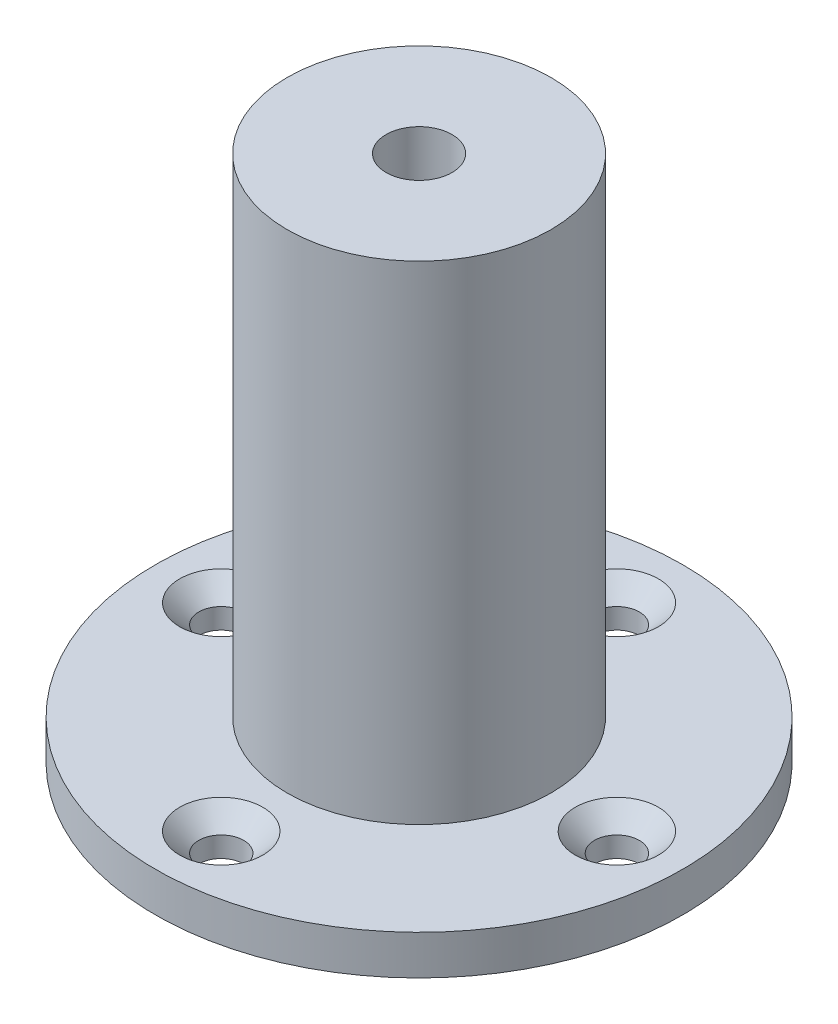
ISO-10303-21;
HEADER;
FILE_DESCRIPTION(('STEP AP214'),'2;1');
FILE_NAME('part.step','',(''),(''),'','','');
FILE_SCHEMA(('AUTOMOTIVE_DESIGN { 1 0 10303 214 1 1 1 1 }'));
ENDSEC;
DATA;
#1=APPLICATION_CONTEXT('core data for automotive mechanical design processes');
#2=APPLICATION_PROTOCOL_DEFINITION('international standard','automotive_design',2000,#1);
#3=PRODUCT_CONTEXT('',#1,'mechanical');
#4=PRODUCT('Part','Part','',(#3));
#5=PRODUCT_RELATED_PRODUCT_CATEGORY('part','',(#4));
#6=PRODUCT_DEFINITION_FORMATION('','',#4);
#7=PRODUCT_DEFINITION_CONTEXT('part definition',#1,'design');
#8=PRODUCT_DEFINITION('design','',#6,#7);
#9=PRODUCT_DEFINITION_SHAPE('','',#8);
#10=(LENGTH_UNIT() NAMED_UNIT(*) SI_UNIT(.MILLI.,.METRE.));
#11=(NAMED_UNIT(*) PLANE_ANGLE_UNIT() SI_UNIT($,.RADIAN.));
#12=(NAMED_UNIT(*) SI_UNIT($,.STERADIAN.) SOLID_ANGLE_UNIT());
#13=UNCERTAINTY_MEASURE_WITH_UNIT(LENGTH_MEASURE(1.E-05),#10,'distance_accuracy_value','');
#14=(GEOMETRIC_REPRESENTATION_CONTEXT(3) GLOBAL_UNCERTAINTY_ASSIGNED_CONTEXT((#13)) GLOBAL_UNIT_ASSIGNED_CONTEXT((#10,
#11,#12)) REPRESENTATION_CONTEXT('',''));
#15=CARTESIAN_POINT('',(0.,0.,0.));
#16=DIRECTION('',(0.,0.,1.));
#17=DIRECTION('',(1.,0.,0.));
#18=AXIS2_PLACEMENT_3D('',#15,#16,#17);
#19=CARTESIAN_POINT('',(0.,40.,0.));
#20=DIRECTION('',(0.,-1.,0.));
#21=DIRECTION('',(0.,0.,-1.));
#22=AXIS2_PLACEMENT_3D('',#19,#20,#21);
#23=CYLINDRICAL_SURFACE('',#22,10.);
#24=CARTESIAN_POINT('',(0.,40.,0.));
#25=DIRECTION('',(0.,1.,0.));
#26=DIRECTION('',(0.,0.,1.));
#27=AXIS2_PLACEMENT_3D('',#24,#25,#26);
#28=CIRCLE('',#27,10.);
#29=CARTESIAN_POINT('',(0.,40.,10.));
#30=VERTEX_POINT('',#29);
#31=EDGE_CURVE('E39',#30,#30,#28,.T.);
#32=ORIENTED_EDGE('',*,*,#31,.F.);
#33=EDGE_LOOP('',(#32));
#34=FACE_BOUND('',#33,.T.);
#35=CARTESIAN_POINT('',(0.,3.,0.));
#36=DIRECTION('',(0.,-1.,0.));
#37=DIRECTION('',(0.,0.,-1.));
#38=AXIS2_PLACEMENT_3D('',#35,#36,#37);
#39=CIRCLE('',#38,10.);
#40=CARTESIAN_POINT('',(0.,3.,-10.));
#41=VERTEX_POINT('',#40);
#42=EDGE_CURVE('E11',#41,#41,#39,.T.);
#43=ORIENTED_EDGE('',*,*,#42,.F.);
#44=EDGE_LOOP('',(#43));
#45=FACE_BOUND('',#44,.T.);
#46=ADVANCED_FACE('F33',(#34,#45),#23,.T.);
#47=CARTESIAN_POINT('',(0.,40.,0.));
#48=DIRECTION('',(0.,1.,0.));
#49=DIRECTION('',(0.,0.,1.));
#50=AXIS2_PLACEMENT_3D('',#47,#48,#49);
#51=PLANE('',#50);
#52=CARTESIAN_POINT('',(0.,40.,0.));
#53=DIRECTION('',(0.,1.,0.));
#54=DIRECTION('',(0.,0.,1.));
#55=AXIS2_PLACEMENT_3D('',#52,#53,#54);
#56=CIRCLE('',#55,2.49999999999999);
#57=CARTESIAN_POINT('',(0.,40.,2.49999999999999));
#58=VERTEX_POINT('',#57);
#59=EDGE_CURVE('E53',#58,#58,#56,.T.);
#60=ORIENTED_EDGE('',*,*,#59,.F.);
#61=EDGE_LOOP('',(#60));
#62=FACE_BOUND('',#61,.T.);
#63=ORIENTED_EDGE('',*,*,#31,.T.);
#64=EDGE_LOOP('',(#63));
#65=FACE_BOUND('',#64,.T.);
#66=ADVANCED_FACE('F101',(#62,#65),#51,.T.);
#67=CARTESIAN_POINT('',(0.,3.,0.));
#68=DIRECTION('',(0.,-1.,0.));
#69=DIRECTION('',(0.,0.,-1.));
#70=AXIS2_PLACEMENT_3D('',#67,#68,#69);
#71=CYLINDRICAL_SURFACE('',#70,20.);
#72=CARTESIAN_POINT('',(0.,3.,0.));
#73=DIRECTION('',(0.,-1.,0.));
#74=DIRECTION('',(0.,0.,-1.));
#75=AXIS2_PLACEMENT_3D('',#72,#73,#74);
#76=CIRCLE('',#75,20.);
#77=CARTESIAN_POINT('',(0.,3.,-20.));
#78=VERTEX_POINT('',#77);
#79=EDGE_CURVE('E94',#78,#78,#76,.T.);
#80=ORIENTED_EDGE('',*,*,#79,.T.);
#81=EDGE_LOOP('',(#80));
#82=FACE_BOUND('',#81,.T.);
#83=CARTESIAN_POINT('',(0.,0.,0.));
#84=DIRECTION('',(0.,-1.,0.));
#85=DIRECTION('',(0.,0.,-1.));
#86=AXIS2_PLACEMENT_3D('',#83,#84,#85);
#87=CIRCLE('',#86,20.);
#88=CARTESIAN_POINT('',(0.,0.,-20.));
#89=VERTEX_POINT('',#88);
#90=EDGE_CURVE('E93',#89,#89,#87,.T.);
#91=ORIENTED_EDGE('',*,*,#90,.F.);
#92=EDGE_LOOP('',(#91));
#93=FACE_BOUND('',#92,.T.);
#94=ADVANCED_FACE('F111',(#82,#93),#71,.T.);
#95=CARTESIAN_POINT('',(0.,3.,0.));
#96=DIRECTION('',(0.,-1.,0.));
#97=DIRECTION('',(0.,0.,-1.));
#98=AXIS2_PLACEMENT_3D('',#95,#96,#97);
#99=PLANE('',#98);
#100=CARTESIAN_POINT('',(-15.,3.,-1.57116660247941E-13));
#101=DIRECTION('',(0.,1.,0.));
#102=DIRECTION('',(0.,0.,1.));
#103=AXIS2_PLACEMENT_3D('',#100,#101,#102);
#104=CIRCLE('',#103,3.15);
#105=CARTESIAN_POINT('',(-15.,3.,3.14999999999984));
#106=VERTEX_POINT('',#105);
#107=EDGE_CURVE('E52',#106,#106,#104,.T.);
#108=ORIENTED_EDGE('',*,*,#107,.F.);
#109=EDGE_LOOP('',(#108));
#110=FACE_BOUND('',#109,.T.);
#111=CARTESIAN_POINT('',(0.,3.,15.));
#112=DIRECTION('',(0.,1.,0.));
#113=DIRECTION('',(0.,0.,1.));
#114=AXIS2_PLACEMENT_3D('',#111,#112,#113);
#115=CIRCLE('',#114,3.15);
#116=CARTESIAN_POINT('',(0.,3.,18.15));
#117=VERTEX_POINT('',#116);
#118=EDGE_CURVE('E66',#117,#117,#115,.T.);
#119=ORIENTED_EDGE('',*,*,#118,.F.);
#120=EDGE_LOOP('',(#119));
#121=FACE_BOUND('',#120,.T.);
#122=CARTESIAN_POINT('',(15.,3.,0.));
#123=DIRECTION('',(0.,1.,0.));
#124=DIRECTION('',(0.,0.,1.));
#125=AXIS2_PLACEMENT_3D('',#122,#123,#124);
#126=CIRCLE('',#125,3.15);
#127=CARTESIAN_POINT('',(15.,3.,3.15000000000005));
#128=VERTEX_POINT('',#127);
#129=EDGE_CURVE('E75',#128,#128,#126,.T.);
#130=ORIENTED_EDGE('',*,*,#129,.F.);
#131=EDGE_LOOP('',(#130));
#132=FACE_BOUND('',#131,.T.);
#133=CARTESIAN_POINT('',(0.,3.,-15.));
#134=DIRECTION('',(0.,1.,0.));
#135=DIRECTION('',(0.,0.,1.));
#136=AXIS2_PLACEMENT_3D('',#133,#134,#135);
#137=CIRCLE('',#136,3.15);
#138=CARTESIAN_POINT('',(0.,3.,-11.85));
#139=VERTEX_POINT('',#138);
#140=EDGE_CURVE('E84',#139,#139,#137,.T.);
#141=ORIENTED_EDGE('',*,*,#140,.F.);
#142=EDGE_LOOP('',(#141));
#143=FACE_BOUND('',#142,.T.);
#144=ORIENTED_EDGE('',*,*,#42,.T.);
#145=EDGE_LOOP('',(#144));
#146=FACE_BOUND('',#145,.T.);
#147=ORIENTED_EDGE('',*,*,#79,.F.);
#148=EDGE_LOOP('',(#147));
#149=FACE_BOUND('',#148,.T.);
#150=ADVANCED_FACE('F107',(#110,#121,#132,#143,#146,#149),#99,.F.);
#151=CARTESIAN_POINT('',(0.,0.,0.));
#152=DIRECTION('',(0.,1.,0.));
#153=DIRECTION('',(0.,0.,1.));
#154=AXIS2_PLACEMENT_3D('',#151,#152,#153);
#155=PLANE('',#154);
#156=CARTESIAN_POINT('',(-15.,0.,-1.57116660247941E-13));
#157=DIRECTION('',(0.,1.,0.));
#158=DIRECTION('',(0.,0.,1.));
#159=AXIS2_PLACEMENT_3D('',#156,#157,#158);
#160=CIRCLE('',#159,1.7);
#161=CARTESIAN_POINT('',(-15.,0.,1.69999999999984));
#162=VERTEX_POINT('',#161);
#163=EDGE_CURVE('E63',#162,#162,#160,.T.);
#164=ORIENTED_EDGE('',*,*,#163,.T.);
#165=EDGE_LOOP('',(#164));
#166=FACE_BOUND('',#165,.T.);
#167=CARTESIAN_POINT('',(0.,0.,15.));
#168=DIRECTION('',(0.,1.,0.));
#169=DIRECTION('',(0.,0.,1.));
#170=AXIS2_PLACEMENT_3D('',#167,#168,#169);
#171=CIRCLE('',#170,1.7);
#172=CARTESIAN_POINT('',(0.,0.,16.7));
#173=VERTEX_POINT('',#172);
#174=EDGE_CURVE('E72',#173,#173,#171,.T.);
#175=ORIENTED_EDGE('',*,*,#174,.T.);
#176=EDGE_LOOP('',(#175));
#177=FACE_BOUND('',#176,.T.);
#178=CARTESIAN_POINT('',(15.,0.,0.));
#179=DIRECTION('',(0.,1.,0.));
#180=DIRECTION('',(0.,0.,1.));
#181=AXIS2_PLACEMENT_3D('',#178,#179,#180);
#182=CIRCLE('',#181,1.7);
#183=CARTESIAN_POINT('',(15.,0.,1.70000000000005));
#184=VERTEX_POINT('',#183);
#185=EDGE_CURVE('E81',#184,#184,#182,.T.);
#186=ORIENTED_EDGE('',*,*,#185,.T.);
#187=EDGE_LOOP('',(#186));
#188=FACE_BOUND('',#187,.T.);
#189=CARTESIAN_POINT('',(0.,0.,-15.));
#190=DIRECTION('',(0.,1.,0.));
#191=DIRECTION('',(0.,0.,1.));
#192=AXIS2_PLACEMENT_3D('',#189,#190,#191);
#193=CIRCLE('',#192,1.7);
#194=CARTESIAN_POINT('',(0.,0.,-13.3));
#195=VERTEX_POINT('',#194);
#196=EDGE_CURVE('E90',#195,#195,#193,.T.);
#197=ORIENTED_EDGE('',*,*,#196,.T.);
#198=EDGE_LOOP('',(#197));
#199=FACE_BOUND('',#198,.T.);
#200=ORIENTED_EDGE('',*,*,#90,.T.);
#201=EDGE_LOOP('',(#200));
#202=FACE_BOUND('',#201,.T.);
#203=ADVANCED_FACE('F110',(#166,#177,#188,#199,#202),#155,.F.);
#204=CARTESIAN_POINT('',(0.,3.,-15.));
#205=DIRECTION('',(0.,1.,0.));
#206=DIRECTION('',(0.,0.,1.));
#207=AXIS2_PLACEMENT_3D('',#204,#205,#206);
#208=CYLINDRICAL_SURFACE('',#207,1.7);
#209=ORIENTED_EDGE('',*,*,#196,.F.);
#210=EDGE_LOOP('',(#209));
#211=FACE_BOUND('',#210,.T.);
#212=CARTESIAN_POINT('',(0.,1.55,-15.));
#213=DIRECTION('',(0.,1.,0.));
#214=DIRECTION('',(0.,0.,1.));
#215=AXIS2_PLACEMENT_3D('',#212,#213,#214);
#216=CIRCLE('',#215,1.7);
#217=CARTESIAN_POINT('',(0.,1.55,-13.3));
#218=VERTEX_POINT('',#217);
#219=EDGE_CURVE('E87',#218,#218,#216,.T.);
#220=ORIENTED_EDGE('',*,*,#219,.T.);
#221=EDGE_LOOP('',(#220));
#222=FACE_BOUND('',#221,.T.);
#223=ADVANCED_FACE('F122',(#211,#222),#208,.F.);
#224=CARTESIAN_POINT('',(0.,3.,-15.));
#225=DIRECTION('',(0.,1.,0.));
#226=DIRECTION('',(0.,0.,1.));
#227=AXIS2_PLACEMENT_3D('',#224,#225,#226);
#228=CONICAL_SURFACE('',#227,3.15,0.785398163397448);
#229=ORIENTED_EDGE('',*,*,#219,.F.);
#230=EDGE_LOOP('',(#229));
#231=FACE_BOUND('',#230,.T.);
#232=ORIENTED_EDGE('',*,*,#140,.T.);
#233=EDGE_LOOP('',(#232));
#234=FACE_BOUND('',#233,.T.);
#235=ADVANCED_FACE('F127',(#231,#234),#228,.F.);
#236=CARTESIAN_POINT('',(15.,3.,0.));
#237=DIRECTION('',(0.,1.,0.));
#238=DIRECTION('',(0.,0.,1.));
#239=AXIS2_PLACEMENT_3D('',#236,#237,#238);
#240=CYLINDRICAL_SURFACE('',#239,1.7);
#241=ORIENTED_EDGE('',*,*,#185,.F.);
#242=EDGE_LOOP('',(#241));
#243=FACE_BOUND('',#242,.T.);
#244=CARTESIAN_POINT('',(15.,1.55,0.));
#245=DIRECTION('',(0.,1.,0.));
#246=DIRECTION('',(0.,0.,1.));
#247=AXIS2_PLACEMENT_3D('',#244,#245,#246);
#248=CIRCLE('',#247,1.7);
#249=CARTESIAN_POINT('',(15.,1.55,1.70000000000005));
#250=VERTEX_POINT('',#249);
#251=EDGE_CURVE('E78',#250,#250,#248,.T.);
#252=ORIENTED_EDGE('',*,*,#251,.T.);
#253=EDGE_LOOP('',(#252));
#254=FACE_BOUND('',#253,.T.);
#255=ADVANCED_FACE('F137',(#243,#254),#240,.F.);
#256=CARTESIAN_POINT('',(15.,3.,0.));
#257=DIRECTION('',(0.,1.,0.));
#258=DIRECTION('',(0.,0.,1.));
#259=AXIS2_PLACEMENT_3D('',#256,#257,#258);
#260=CONICAL_SURFACE('',#259,3.15,0.785398163397448);
#261=ORIENTED_EDGE('',*,*,#251,.F.);
#262=EDGE_LOOP('',(#261));
#263=FACE_BOUND('',#262,.T.);
#264=ORIENTED_EDGE('',*,*,#129,.T.);
#265=EDGE_LOOP('',(#264));
#266=FACE_BOUND('',#265,.T.);
#267=ADVANCED_FACE('F141',(#263,#266),#260,.F.);
#268=CARTESIAN_POINT('',(0.,3.,15.));
#269=DIRECTION('',(0.,1.,0.));
#270=DIRECTION('',(0.,0.,1.));
#271=AXIS2_PLACEMENT_3D('',#268,#269,#270);
#272=CYLINDRICAL_SURFACE('',#271,1.7);
#273=ORIENTED_EDGE('',*,*,#174,.F.);
#274=EDGE_LOOP('',(#273));
#275=FACE_BOUND('',#274,.T.);
#276=CARTESIAN_POINT('',(0.,1.55,15.));
#277=DIRECTION('',(0.,1.,0.));
#278=DIRECTION('',(0.,0.,1.));
#279=AXIS2_PLACEMENT_3D('',#276,#277,#278);
#280=CIRCLE('',#279,1.7);
#281=CARTESIAN_POINT('',(0.,1.55,16.7));
#282=VERTEX_POINT('',#281);
#283=EDGE_CURVE('E69',#282,#282,#280,.T.);
#284=ORIENTED_EDGE('',*,*,#283,.T.);
#285=EDGE_LOOP('',(#284));
#286=FACE_BOUND('',#285,.T.);
#287=ADVANCED_FACE('F145',(#275,#286),#272,.F.);
#288=CARTESIAN_POINT('',(0.,3.,15.));
#289=DIRECTION('',(0.,1.,0.));
#290=DIRECTION('',(0.,0.,1.));
#291=AXIS2_PLACEMENT_3D('',#288,#289,#290);
#292=CONICAL_SURFACE('',#291,3.15,0.785398163397448);
#293=ORIENTED_EDGE('',*,*,#283,.F.);
#294=EDGE_LOOP('',(#293));
#295=FACE_BOUND('',#294,.T.);
#296=ORIENTED_EDGE('',*,*,#118,.T.);
#297=EDGE_LOOP('',(#296));
#298=FACE_BOUND('',#297,.T.);
#299=ADVANCED_FACE('F149',(#295,#298),#292,.F.);
#300=CARTESIAN_POINT('',(-15.,3.,-1.57116660247941E-13));
#301=DIRECTION('',(0.,1.,0.));
#302=DIRECTION('',(0.,0.,1.));
#303=AXIS2_PLACEMENT_3D('',#300,#301,#302);
#304=CYLINDRICAL_SURFACE('',#303,1.7);
#305=ORIENTED_EDGE('',*,*,#163,.F.);
#306=EDGE_LOOP('',(#305));
#307=FACE_BOUND('',#306,.T.);
#308=CARTESIAN_POINT('',(-15.,1.55,-1.57116660247941E-13));
#309=DIRECTION('',(0.,1.,0.));
#310=DIRECTION('',(0.,0.,1.));
#311=AXIS2_PLACEMENT_3D('',#308,#309,#310);
#312=CIRCLE('',#311,1.7);
#313=CARTESIAN_POINT('',(-15.,1.55,1.69999999999984));
#314=VERTEX_POINT('',#313);
#315=EDGE_CURVE('E56',#314,#314,#312,.T.);
#316=ORIENTED_EDGE('',*,*,#315,.T.);
#317=EDGE_LOOP('',(#316));
#318=FACE_BOUND('',#317,.T.);
#319=ADVANCED_FACE('F153',(#307,#318),#304,.F.);
#320=CARTESIAN_POINT('',(-15.,3.,-1.57116660247941E-13));
#321=DIRECTION('',(0.,1.,0.));
#322=DIRECTION('',(0.,0.,1.));
#323=AXIS2_PLACEMENT_3D('',#320,#321,#322);
#324=CONICAL_SURFACE('',#323,3.15,0.785398163397448);
#325=ORIENTED_EDGE('',*,*,#315,.F.);
#326=EDGE_LOOP('',(#325));
#327=FACE_BOUND('',#326,.T.);
#328=ORIENTED_EDGE('',*,*,#107,.T.);
#329=EDGE_LOOP('',(#328));
#330=FACE_BOUND('',#329,.T.);
#331=ADVANCED_FACE('F46',(#327,#330),#324,.F.);
#332=CARTESIAN_POINT('',(0.,23.,0.));
#333=DIRECTION('',(0.,1.,0.));
#334=DIRECTION('',(0.,0.,1.));
#335=AXIS2_PLACEMENT_3D('',#332,#333,#334);
#336=CONICAL_SURFACE('',#335,2.49999999999999,1.02974425867665);
#337=CARTESIAN_POINT('',(0.,21.4978484524311,0.));
#338=VERTEX_POINT('',#337);
#339=VERTEX_LOOP('',#338);
#340=FACE_BOUND('',#339,.T.);
#341=CARTESIAN_POINT('',(0.,23.,0.));
#342=DIRECTION('',(0.,1.,0.));
#343=DIRECTION('',(0.,0.,1.));
#344=AXIS2_PLACEMENT_3D('',#341,#342,#343);
#345=CIRCLE('',#344,2.49999999999999);
#346=CARTESIAN_POINT('',(0.,23.,2.49999999999999));
#347=VERTEX_POINT('',#346);
#348=EDGE_CURVE('E50',#347,#347,#345,.T.);
#349=ORIENTED_EDGE('',*,*,#348,.T.);
#350=EDGE_LOOP('',(#349));
#351=FACE_BOUND('',#350,.T.);
#352=ADVANCED_FACE('F42',(#340,#351),#336,.F.);
#353=CARTESIAN_POINT('',(0.,40.,0.));
#354=DIRECTION('',(0.,1.,0.));
#355=DIRECTION('',(0.,0.,1.));
#356=AXIS2_PLACEMENT_3D('',#353,#354,#355);
#357=CYLINDRICAL_SURFACE('',#356,2.49999999999999);
#358=ORIENTED_EDGE('',*,*,#348,.F.);
#359=EDGE_LOOP('',(#358));
#360=FACE_BOUND('',#359,.T.);
#361=ORIENTED_EDGE('',*,*,#59,.T.);
#362=EDGE_LOOP('',(#361));
#363=FACE_BOUND('',#362,.T.);
#364=ADVANCED_FACE('F45',(#360,#363),#357,.F.);
#365=CLOSED_SHELL('',(#46,#66,#94,#150,#203,#223,#235,#255,#267,#287,#299,#319,#331,#352,#364));
#366=MANIFOLD_SOLID_BREP('B2',#365);
#367=ADVANCED_BREP_SHAPE_REPRESENTATION('',(#18,#366),#14);
#368=SHAPE_DEFINITION_REPRESENTATION(#9,#367);
ENDSEC;
END-ISO-10303-21;
